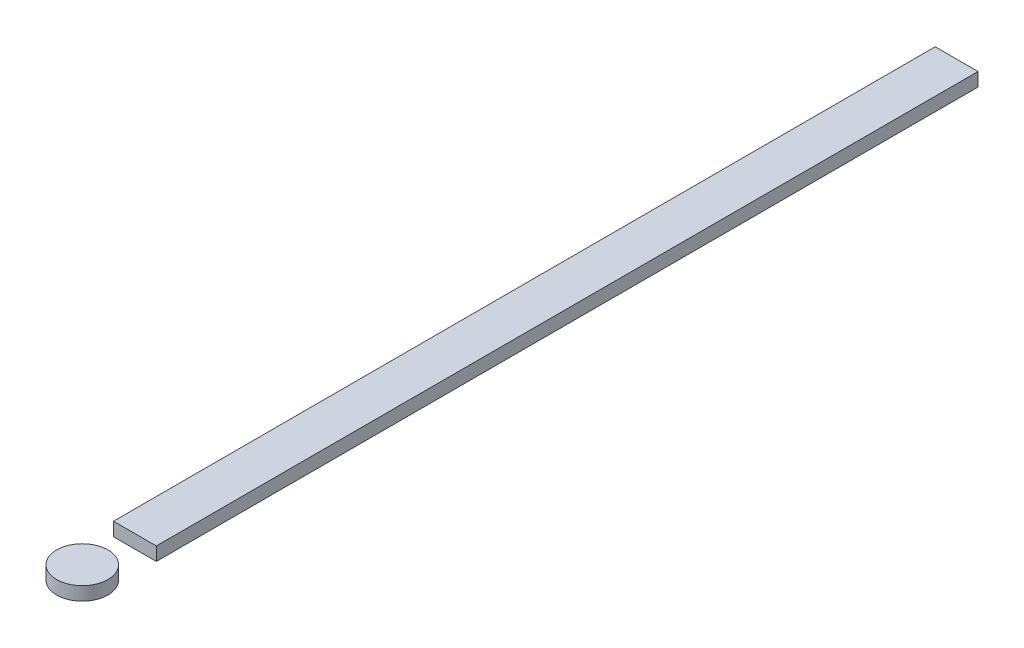
ISO-10303-21;
HEADER;
FILE_DESCRIPTION(('STEP AP214'),'2;1');
FILE_NAME('part.step','',(''),(''),'','','');
FILE_SCHEMA(('AUTOMOTIVE_DESIGN { 1 0 10303 214 1 1 1 1 }'));
ENDSEC;
DATA;
#1=APPLICATION_CONTEXT('core data for automotive mechanical design processes');
#2=APPLICATION_PROTOCOL_DEFINITION('international standard','automotive_design',2000,#1);
#3=PRODUCT_CONTEXT('',#1,'mechanical');
#4=PRODUCT('Part','Part','',(#3));
#5=PRODUCT_RELATED_PRODUCT_CATEGORY('part','',(#4));
#6=PRODUCT_DEFINITION_FORMATION('','',#4);
#7=PRODUCT_DEFINITION_CONTEXT('part definition',#1,'design');
#8=PRODUCT_DEFINITION('design','',#6,#7);
#9=PRODUCT_DEFINITION_SHAPE('','',#8);
#10=(LENGTH_UNIT() NAMED_UNIT(*) SI_UNIT(.MILLI.,.METRE.));
#11=(NAMED_UNIT(*) PLANE_ANGLE_UNIT() SI_UNIT($,.RADIAN.));
#12=(NAMED_UNIT(*) SI_UNIT($,.STERADIAN.) SOLID_ANGLE_UNIT());
#13=UNCERTAINTY_MEASURE_WITH_UNIT(LENGTH_MEASURE(1.E-05),#10,'distance_accuracy_value','');
#14=(GEOMETRIC_REPRESENTATION_CONTEXT(3) GLOBAL_UNCERTAINTY_ASSIGNED_CONTEXT((#13)) GLOBAL_UNIT_ASSIGNED_CONTEXT((#10,
#11,#12)) REPRESENTATION_CONTEXT('',''));
#15=CARTESIAN_POINT('',(0.,0.,0.));
#16=DIRECTION('',(0.,0.,1.));
#17=DIRECTION('',(1.,0.,0.));
#18=AXIS2_PLACEMENT_3D('',#15,#16,#17);
#19=CARTESIAN_POINT('',(-1.63566649261077,1.,-3.95194588818723));
#20=DIRECTION('',(1.,0.,0.));
#21=DIRECTION('',(0.,0.,-1.));
#22=AXIS2_PLACEMENT_3D('',#19,#20,#21);
#23=PLANE('',#22);
#24=DIRECTION('',(0.,0.,1.));
#25=VECTOR('',#24,1.);
#26=CARTESIAN_POINT('',(-1.63566649261077,0.,-3.95194588818723));
#27=LINE('',#26,#25);
#28=CARTESIAN_POINT('',(-1.63566649261077,0.,-64.9119458881872));
#29=VERTEX_POINT('',#28);
#30=CARTESIAN_POINT('',(-1.63566649261077,0.,-3.95194588818723));
#31=VERTEX_POINT('',#30);
#32=EDGE_CURVE('E104',#29,#31,#27,.T.);
#33=ORIENTED_EDGE('',*,*,#32,.T.);
#34=DIRECTION('',(0.,-1.,0.));
#35=VECTOR('',#34,1.);
#36=CARTESIAN_POINT('',(-1.63566649261077,1.,-3.95194588818723));
#37=LINE('',#36,#35);
#38=CARTESIAN_POINT('',(-1.63566649261077,1.,-3.95194588818723));
#39=VERTEX_POINT('',#38);
#40=EDGE_CURVE('E12',#39,#31,#37,.T.);
#41=ORIENTED_EDGE('',*,*,#40,.F.);
#42=DIRECTION('',(0.,0.,1.));
#43=VECTOR('',#42,1.);
#44=CARTESIAN_POINT('',(-1.63566649261077,1.,-3.95194588818723));
#45=LINE('',#44,#43);
#46=CARTESIAN_POINT('',(-1.63566649261077,1.,-64.9119458881872));
#47=VERTEX_POINT('',#46);
#48=EDGE_CURVE('E92',#47,#39,#45,.T.);
#49=ORIENTED_EDGE('',*,*,#48,.F.);
#50=DIRECTION('',(0.,-1.,0.));
#51=VECTOR('',#50,1.);
#52=CARTESIAN_POINT('',(-1.63566649261077,1.,-64.9119458881872));
#53=LINE('',#52,#51);
#54=EDGE_CURVE('E100',#47,#29,#53,.T.);
#55=ORIENTED_EDGE('',*,*,#54,.T.);
#56=EDGE_LOOP('',(#33,#41,#49,#55));
#57=FACE_BOUND('',#56,.T.);
#58=ADVANCED_FACE('F41',(#57),#23,.F.);
#59=CARTESIAN_POINT('',(-1.63566649261077,1.,-3.95194588818723));
#60=DIRECTION('',(0.,0.,-1.));
#61=DIRECTION('',(-1.,0.,0.));
#62=AXIS2_PLACEMENT_3D('',#59,#60,#61);
#63=PLANE('',#62);
#64=DIRECTION('',(1.,0.,0.));
#65=VECTOR('',#64,1.);
#66=CARTESIAN_POINT('',(-1.63566649261077,0.,-3.95194588818723));
#67=LINE('',#66,#65);
#68=CARTESIAN_POINT('',(1.53933350738923,0.,-3.95194588818724));
#69=VERTEX_POINT('',#68);
#70=EDGE_CURVE('E96',#31,#69,#67,.T.);
#71=ORIENTED_EDGE('',*,*,#70,.T.);
#72=DIRECTION('',(0.,-1.,0.));
#73=VECTOR('',#72,1.);
#74=CARTESIAN_POINT('',(1.53933350738923,1.,-3.95194588818724));
#75=LINE('',#74,#73);
#76=CARTESIAN_POINT('',(1.53933350738923,1.,-3.95194588818724));
#77=VERTEX_POINT('',#76);
#78=EDGE_CURVE('E49',#77,#69,#75,.T.);
#79=ORIENTED_EDGE('',*,*,#78,.F.);
#80=DIRECTION('',(1.,0.,0.));
#81=VECTOR('',#80,1.);
#82=CARTESIAN_POINT('',(-1.63566649261077,1.,-3.95194588818723));
#83=LINE('',#82,#81);
#84=EDGE_CURVE('E87',#39,#77,#83,.T.);
#85=ORIENTED_EDGE('',*,*,#84,.F.);
#86=ORIENTED_EDGE('',*,*,#40,.T.);
#87=EDGE_LOOP('',(#71,#79,#85,#86));
#88=FACE_BOUND('',#87,.T.);
#89=ADVANCED_FACE('F95',(#88),#63,.F.);
#90=CARTESIAN_POINT('',(1.53933350738923,1.,-3.95194588818724));
#91=DIRECTION('',(-1.,0.,0.));
#92=DIRECTION('',(0.,0.,1.));
#93=AXIS2_PLACEMENT_3D('',#90,#91,#92);
#94=PLANE('',#93);
#95=DIRECTION('',(0.,0.,-1.));
#96=VECTOR('',#95,1.);
#97=CARTESIAN_POINT('',(1.53933350738923,0.,-3.95194588818724));
#98=LINE('',#97,#96);
#99=CARTESIAN_POINT('',(1.53933350738923,0.,-64.9119458881872));
#100=VERTEX_POINT('',#99);
#101=EDGE_CURVE('E74',#69,#100,#98,.T.);
#102=ORIENTED_EDGE('',*,*,#101,.T.);
#103=DIRECTION('',(0.,-1.,0.));
#104=VECTOR('',#103,1.);
#105=CARTESIAN_POINT('',(1.53933350738923,1.,-64.9119458881872));
#106=LINE('',#105,#104);
#107=CARTESIAN_POINT('',(1.53933350738923,1.,-64.9119458881872));
#108=VERTEX_POINT('',#107);
#109=EDGE_CURVE('E97',#108,#100,#106,.T.);
#110=ORIENTED_EDGE('',*,*,#109,.F.);
#111=DIRECTION('',(0.,0.,-1.));
#112=VECTOR('',#111,1.);
#113=CARTESIAN_POINT('',(1.53933350738923,1.,-3.95194588818724));
#114=LINE('',#113,#112);
#115=EDGE_CURVE('E90',#77,#108,#114,.T.);
#116=ORIENTED_EDGE('',*,*,#115,.F.);
#117=ORIENTED_EDGE('',*,*,#78,.T.);
#118=EDGE_LOOP('',(#102,#110,#116,#117));
#119=FACE_BOUND('',#118,.T.);
#120=ADVANCED_FACE('F98',(#119),#94,.F.);
#121=CARTESIAN_POINT('',(-1.63566649261077,1.,-64.9119458881872));
#122=DIRECTION('',(0.,0.,1.));
#123=DIRECTION('',(1.,0.,0.));
#124=AXIS2_PLACEMENT_3D('',#121,#122,#123);
#125=PLANE('',#124);
#126=DIRECTION('',(-1.,0.,0.));
#127=VECTOR('',#126,1.);
#128=CARTESIAN_POINT('',(-1.63566649261077,0.,-64.9119458881872));
#129=LINE('',#128,#127);
#130=EDGE_CURVE('E80',#100,#29,#129,.T.);
#131=ORIENTED_EDGE('',*,*,#130,.T.);
#132=ORIENTED_EDGE('',*,*,#54,.F.);
#133=DIRECTION('',(-1.,0.,0.));
#134=VECTOR('',#133,1.);
#135=CARTESIAN_POINT('',(-1.63566649261077,1.,-64.9119458881872));
#136=LINE('',#135,#134);
#137=EDGE_CURVE('E57',#108,#47,#136,.T.);
#138=ORIENTED_EDGE('',*,*,#137,.F.);
#139=ORIENTED_EDGE('',*,*,#109,.T.);
#140=EDGE_LOOP('',(#131,#132,#138,#139));
#141=FACE_BOUND('',#140,.T.);
#142=ADVANCED_FACE('F111',(#141),#125,.F.);
#143=CARTESIAN_POINT('',(0.,1.,0.));
#144=DIRECTION('',(0.,-1.,0.));
#145=DIRECTION('',(0.,0.,-1.));
#146=AXIS2_PLACEMENT_3D('',#143,#144,#145);
#147=PLANE('',#146);
#148=ORIENTED_EDGE('',*,*,#48,.T.);
#149=ORIENTED_EDGE('',*,*,#84,.T.);
#150=ORIENTED_EDGE('',*,*,#115,.T.);
#151=ORIENTED_EDGE('',*,*,#137,.T.);
#152=EDGE_LOOP('',(#148,#149,#150,#151));
#153=FACE_BOUND('',#152,.T.);
#154=ADVANCED_FACE('F88',(#153),#147,.F.);
#155=CARTESIAN_POINT('',(0.,0.,0.));
#156=DIRECTION('',(0.,-1.,0.));
#157=DIRECTION('',(0.,0.,-1.));
#158=AXIS2_PLACEMENT_3D('',#155,#156,#157);
#159=PLANE('',#158);
#160=ORIENTED_EDGE('',*,*,#32,.F.);
#161=ORIENTED_EDGE('',*,*,#130,.F.);
#162=ORIENTED_EDGE('',*,*,#101,.F.);
#163=ORIENTED_EDGE('',*,*,#70,.F.);
#164=EDGE_LOOP('',(#160,#161,#162,#163));
#165=FACE_BOUND('',#164,.T.);
#166=ADVANCED_FACE('F114',(#165),#159,.T.);
#167=CLOSED_SHELL('',(#58,#89,#120,#142,#154,#166));
#168=MANIFOLD_SOLID_BREP('B2',#167);
#169=CARTESIAN_POINT('',(0.,1.,0.));
#170=DIRECTION('',(0.,-1.,0.));
#171=DIRECTION('',(0.,0.,-1.));
#172=AXIS2_PLACEMENT_3D('',#169,#170,#171);
#173=CYLINDRICAL_SURFACE('',#172,1.905);
#174=CARTESIAN_POINT('',(0.,1.,0.));
#175=DIRECTION('',(0.,1.,0.));
#176=DIRECTION('',(0.,0.,1.));
#177=AXIS2_PLACEMENT_3D('',#174,#175,#176);
#178=CIRCLE('',#177,1.905);
#179=CARTESIAN_POINT('',(0.,1.,1.905));
#180=VERTEX_POINT('',#179);
#181=EDGE_CURVE('E40',#180,#180,#178,.T.);
#182=ORIENTED_EDGE('',*,*,#181,.F.);
#183=EDGE_LOOP('',(#182));
#184=FACE_BOUND('',#183,.T.);
#185=CARTESIAN_POINT('',(0.,0.,0.));
#186=DIRECTION('',(0.,1.,0.));
#187=DIRECTION('',(0.,0.,1.));
#188=AXIS2_PLACEMENT_3D('',#185,#186,#187);
#189=CIRCLE('',#188,1.905);
#190=CARTESIAN_POINT('',(0.,0.,1.905));
#191=VERTEX_POINT('',#190);
#192=EDGE_CURVE('E168',#191,#191,#189,.T.);
#193=ORIENTED_EDGE('',*,*,#192,.T.);
#194=EDGE_LOOP('',(#193));
#195=FACE_BOUND('',#194,.T.);
#196=ADVANCED_FACE('F165',(#184,#195),#173,.T.);
#197=CARTESIAN_POINT('',(0.,1.,0.));
#198=DIRECTION('',(0.,1.,0.));
#199=DIRECTION('',(0.,0.,1.));
#200=AXIS2_PLACEMENT_3D('',#197,#198,#199);
#201=PLANE('',#200);
#202=ORIENTED_EDGE('',*,*,#181,.T.);
#203=EDGE_LOOP('',(#202));
#204=FACE_BOUND('',#203,.T.);
#205=ADVANCED_FACE('F180',(#204),#201,.T.);
#206=CARTESIAN_POINT('',(0.,0.,0.));
#207=DIRECTION('',(0.,1.,0.));
#208=DIRECTION('',(0.,0.,1.));
#209=AXIS2_PLACEMENT_3D('',#206,#207,#208);
#210=PLANE('',#209);
#211=ORIENTED_EDGE('',*,*,#192,.F.);
#212=EDGE_LOOP('',(#211));
#213=FACE_BOUND('',#212,.T.);
#214=ADVANCED_FACE('F178',(#213),#210,.F.);
#215=CLOSED_SHELL('',(#196,#205,#214));
#216=MANIFOLD_SOLID_BREP('B6',#215);
#217=ADVANCED_BREP_SHAPE_REPRESENTATION('',(#18,#168,#216),#14);
#218=SHAPE_DEFINITION_REPRESENTATION(#9,#217);
ENDSEC;
END-ISO-10303-21;
